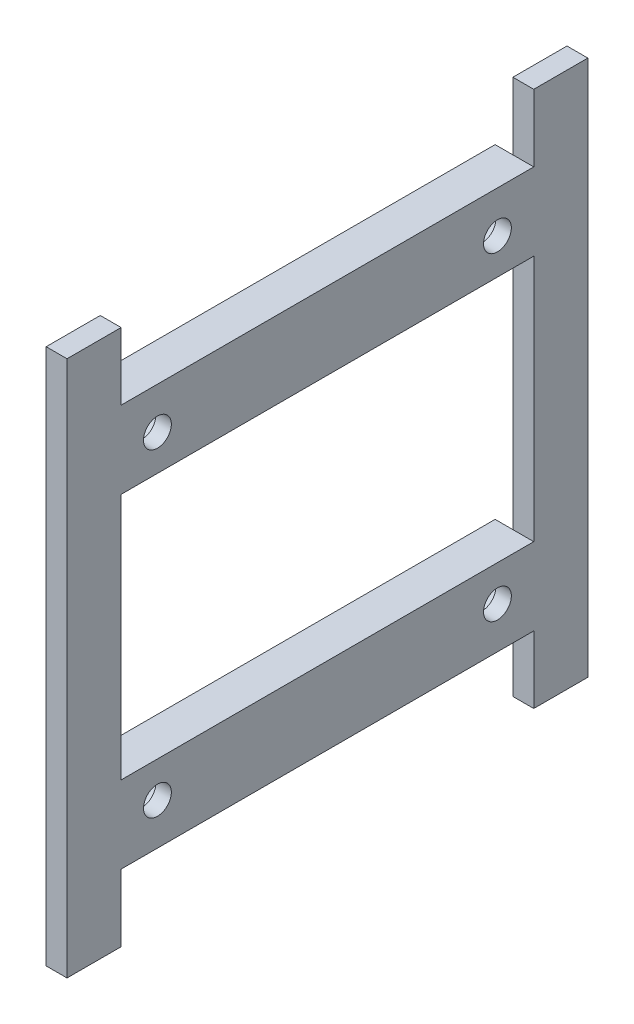
ISO-10303-21;
HEADER;
FILE_DESCRIPTION(('STEP AP214'),'2;1');
FILE_NAME('part.step','',(''),(''),'','','');
FILE_SCHEMA(('AUTOMOTIVE_DESIGN { 1 0 10303 214 1 1 1 1 }'));
ENDSEC;
DATA;
#1=APPLICATION_CONTEXT('core data for automotive mechanical design processes');
#2=APPLICATION_PROTOCOL_DEFINITION('international standard','automotive_design',2000,#1);
#3=PRODUCT_CONTEXT('',#1,'mechanical');
#4=PRODUCT('Part','Part','',(#3));
#5=PRODUCT_RELATED_PRODUCT_CATEGORY('part','',(#4));
#6=PRODUCT_DEFINITION_FORMATION('','',#4);
#7=PRODUCT_DEFINITION_CONTEXT('part definition',#1,'design');
#8=PRODUCT_DEFINITION('design','',#6,#7);
#9=PRODUCT_DEFINITION_SHAPE('','',#8);
#10=(LENGTH_UNIT() NAMED_UNIT(*) SI_UNIT(.MILLI.,.METRE.));
#11=(NAMED_UNIT(*) PLANE_ANGLE_UNIT() SI_UNIT($,.RADIAN.));
#12=(NAMED_UNIT(*) SI_UNIT($,.STERADIAN.) SOLID_ANGLE_UNIT());
#13=UNCERTAINTY_MEASURE_WITH_UNIT(LENGTH_MEASURE(1.E-05),#10,'distance_accuracy_value','');
#14=(GEOMETRIC_REPRESENTATION_CONTEXT(3) GLOBAL_UNCERTAINTY_ASSIGNED_CONTEXT((#13)) GLOBAL_UNIT_ASSIGNED_CONTEXT((#10,
#11,#12)) REPRESENTATION_CONTEXT('',''));
#15=CARTESIAN_POINT('',(0.,0.,0.));
#16=DIRECTION('',(0.,0.,1.));
#17=DIRECTION('',(1.,0.,0.));
#18=AXIS2_PLACEMENT_3D('',#15,#16,#17);
#19=CARTESIAN_POINT('',(-5.,20.6258765678246,22.));
#20=DIRECTION('',(1.,0.,0.));
#21=DIRECTION('',(0.,0.,-1.));
#22=AXIS2_PLACEMENT_3D('',#19,#20,#21);
#23=CYLINDRICAL_SURFACE('',#22,1.8);
#24=CARTESIAN_POINT('',(0.,20.6258765678246,22.));
#25=DIRECTION('',(1.,0.,0.));
#26=DIRECTION('',(0.,0.,-1.));
#27=AXIS2_PLACEMENT_3D('',#24,#25,#26);
#28=CIRCLE('',#27,1.8);
#29=CARTESIAN_POINT('',(0.,20.6258765678246,20.2));
#30=VERTEX_POINT('',#29);
#31=EDGE_CURVE('E316',#30,#30,#28,.T.);
#32=ORIENTED_EDGE('',*,*,#31,.T.);
#33=EDGE_LOOP('',(#32));
#34=FACE_BOUND('',#33,.T.);
#35=CARTESIAN_POINT('',(-2.,20.6258765678246,22.));
#36=DIRECTION('',(-1.,0.,0.));
#37=DIRECTION('',(0.,0.,1.));
#38=AXIS2_PLACEMENT_3D('',#35,#36,#37);
#39=CIRCLE('',#38,1.8);
#40=CARTESIAN_POINT('',(-2.,20.6258765678246,23.8));
#41=VERTEX_POINT('',#40);
#42=EDGE_CURVE('E103',#41,#41,#39,.F.);
#43=ORIENTED_EDGE('',*,*,#42,.F.);
#44=EDGE_LOOP('',(#43));
#45=FACE_BOUND('',#44,.T.);
#46=ADVANCED_FACE('F99',(#34,#45),#23,.F.);
#47=CARTESIAN_POINT('',(-5.,20.6258765678246,-22.));
#48=DIRECTION('',(1.,0.,0.));
#49=DIRECTION('',(0.,0.,-1.));
#50=AXIS2_PLACEMENT_3D('',#47,#48,#49);
#51=CYLINDRICAL_SURFACE('',#50,1.8);
#52=CARTESIAN_POINT('',(0.,20.6258765678246,-22.));
#53=DIRECTION('',(-1.,0.,0.));
#54=DIRECTION('',(0.,0.,1.));
#55=AXIS2_PLACEMENT_3D('',#52,#53,#54);
#56=CIRCLE('',#55,1.8);
#57=CARTESIAN_POINT('',(0.,20.6258765678246,-20.2));
#58=VERTEX_POINT('',#57);
#59=EDGE_CURVE('E327',#58,#58,#56,.T.);
#60=ORIENTED_EDGE('',*,*,#59,.F.);
#61=EDGE_LOOP('',(#60));
#62=FACE_BOUND('',#61,.T.);
#63=CARTESIAN_POINT('',(-2.,20.6258765678246,-22.));
#64=DIRECTION('',(-1.,0.,0.));
#65=DIRECTION('',(0.,0.,1.));
#66=AXIS2_PLACEMENT_3D('',#63,#64,#65);
#67=CIRCLE('',#66,1.8);
#68=CARTESIAN_POINT('',(-2.,20.6258765678246,-20.2));
#69=VERTEX_POINT('',#68);
#70=EDGE_CURVE('E466',#69,#69,#67,.T.);
#71=ORIENTED_EDGE('',*,*,#70,.T.);
#72=EDGE_LOOP('',(#71));
#73=FACE_BOUND('',#72,.T.);
#74=ADVANCED_FACE('F476',(#62,#73),#51,.F.);
#75=CARTESIAN_POINT('',(-5.,-20.6258765678246,22.));
#76=DIRECTION('',(1.,0.,0.));
#77=DIRECTION('',(0.,0.,-1.));
#78=AXIS2_PLACEMENT_3D('',#75,#76,#77);
#79=CYLINDRICAL_SURFACE('',#78,1.8);
#80=CARTESIAN_POINT('',(0.,-20.6258765678246,22.));
#81=DIRECTION('',(-1.,0.,0.));
#82=DIRECTION('',(0.,0.,1.));
#83=AXIS2_PLACEMENT_3D('',#80,#81,#82);
#84=CIRCLE('',#83,1.8);
#85=CARTESIAN_POINT('',(0.,-20.6258765678246,23.8));
#86=VERTEX_POINT('',#85);
#87=EDGE_CURVE('E370',#86,#86,#84,.T.);
#88=ORIENTED_EDGE('',*,*,#87,.F.);
#89=EDGE_LOOP('',(#88));
#90=FACE_BOUND('',#89,.T.);
#91=CARTESIAN_POINT('',(-2.,-20.6258765678246,22.));
#92=DIRECTION('',(-1.,0.,0.));
#93=DIRECTION('',(0.,0.,1.));
#94=AXIS2_PLACEMENT_3D('',#91,#92,#93);
#95=CIRCLE('',#94,1.8);
#96=CARTESIAN_POINT('',(-2.,-20.6258765678246,23.8));
#97=VERTEX_POINT('',#96);
#98=EDGE_CURVE('E464',#97,#97,#95,.T.);
#99=ORIENTED_EDGE('',*,*,#98,.T.);
#100=EDGE_LOOP('',(#99));
#101=FACE_BOUND('',#100,.T.);
#102=ADVANCED_FACE('F483',(#90,#101),#79,.F.);
#103=CARTESIAN_POINT('',(-5.,-20.6258765678246,-22.));
#104=DIRECTION('',(1.,0.,0.));
#105=DIRECTION('',(0.,0.,-1.));
#106=AXIS2_PLACEMENT_3D('',#103,#104,#105);
#107=CYLINDRICAL_SURFACE('',#106,1.8);
#108=CARTESIAN_POINT('',(0.,-20.6258765678246,-22.));
#109=DIRECTION('',(1.,0.,0.));
#110=DIRECTION('',(0.,0.,-1.));
#111=AXIS2_PLACEMENT_3D('',#108,#109,#110);
#112=CIRCLE('',#111,1.8);
#113=CARTESIAN_POINT('',(0.,-20.6258765678246,-23.8));
#114=VERTEX_POINT('',#113);
#115=EDGE_CURVE('E367',#114,#114,#112,.T.);
#116=ORIENTED_EDGE('',*,*,#115,.T.);
#117=EDGE_LOOP('',(#116));
#118=FACE_BOUND('',#117,.T.);
#119=CARTESIAN_POINT('',(-2.,-20.6258765678246,-22.));
#120=DIRECTION('',(-1.,0.,0.));
#121=DIRECTION('',(0.,0.,1.));
#122=AXIS2_PLACEMENT_3D('',#119,#120,#121);
#123=CIRCLE('',#122,1.8);
#124=CARTESIAN_POINT('',(-2.,-20.6258765678246,-20.2));
#125=VERTEX_POINT('',#124);
#126=EDGE_CURVE('E397',#125,#125,#123,.F.);
#127=ORIENTED_EDGE('',*,*,#126,.F.);
#128=EDGE_LOOP('',(#127));
#129=FACE_BOUND('',#128,.T.);
#130=ADVANCED_FACE('F524',(#118,#129),#107,.F.);
#131=CARTESIAN_POINT('',(-2.7,-34.7,26.7));
#132=DIRECTION('',(0.,0.,-1.));
#133=DIRECTION('',(0.,1.,0.));
#134=AXIS2_PLACEMENT_3D('',#131,#132,#133);
#135=PLANE('',#134);
#136=DIRECTION('',(0.,1.,0.));
#137=VECTOR('',#136,1.);
#138=CARTESIAN_POINT('',(0.,-34.7,26.7));
#139=LINE('',#138,#137);
#140=CARTESIAN_POINT('',(0.,-16.,26.7));
#141=VERTEX_POINT('',#140);
#142=CARTESIAN_POINT('',(0.,16.,26.7));
#143=VERTEX_POINT('',#142);
#144=EDGE_CURVE('E270',#141,#143,#139,.T.);
#145=ORIENTED_EDGE('',*,*,#144,.F.);
#146=DIRECTION('',(1.,0.,0.));
#147=VECTOR('',#146,1.);
#148=CARTESIAN_POINT('',(-5.,-16.,26.7));
#149=LINE('',#148,#147);
#150=CARTESIAN_POINT('',(-2.7,-16.,26.7));
#151=VERTEX_POINT('',#150);
#152=EDGE_CURVE('E389',#151,#141,#149,.T.);
#153=ORIENTED_EDGE('',*,*,#152,.F.);
#154=DIRECTION('',(0.,1.,0.));
#155=VECTOR('',#154,1.);
#156=CARTESIAN_POINT('',(-2.7,-34.7,26.7));
#157=LINE('',#156,#155);
#158=CARTESIAN_POINT('',(-2.7,16.,26.7));
#159=VERTEX_POINT('',#158);
#160=EDGE_CURVE('E293',#151,#159,#157,.T.);
#161=ORIENTED_EDGE('',*,*,#160,.T.);
#162=DIRECTION('',(1.,0.,0.));
#163=VECTOR('',#162,1.);
#164=CARTESIAN_POINT('',(-5.,16.,26.7));
#165=LINE('',#164,#163);
#166=EDGE_CURVE('E304',#159,#143,#165,.T.);
#167=ORIENTED_EDGE('',*,*,#166,.T.);
#168=EDGE_LOOP('',(#145,#153,#161,#167));
#169=FACE_BOUND('',#168,.T.);
#170=ADVANCED_FACE('F436',(#169),#135,.T.);
#171=CARTESIAN_POINT('',(-2.7,-34.7,-26.7));
#172=DIRECTION('',(0.,0.,-1.));
#173=DIRECTION('',(0.,1.,0.));
#174=AXIS2_PLACEMENT_3D('',#171,#172,#173);
#175=PLANE('',#174);
#176=DIRECTION('',(1.,0.,0.));
#177=VECTOR('',#176,1.);
#178=CARTESIAN_POINT('',(-5.,-16.,-26.7));
#179=LINE('',#178,#177);
#180=CARTESIAN_POINT('',(-2.7,-16.,-26.7));
#181=VERTEX_POINT('',#180);
#182=CARTESIAN_POINT('',(0.,-16.,-26.7));
#183=VERTEX_POINT('',#182);
#184=EDGE_CURVE('E385',#181,#183,#179,.T.);
#185=ORIENTED_EDGE('',*,*,#184,.T.);
#186=DIRECTION('',(0.,1.,0.));
#187=VECTOR('',#186,1.);
#188=CARTESIAN_POINT('',(0.,-34.7,-26.7));
#189=LINE('',#188,#187);
#190=CARTESIAN_POINT('',(0.,16.,-26.7));
#191=VERTEX_POINT('',#190);
#192=EDGE_CURVE('E349',#183,#191,#189,.T.);
#193=ORIENTED_EDGE('',*,*,#192,.T.);
#194=DIRECTION('',(1.,0.,0.));
#195=VECTOR('',#194,1.);
#196=CARTESIAN_POINT('',(-5.,16.,-26.7));
#197=LINE('',#196,#195);
#198=CARTESIAN_POINT('',(-2.7,16.,-26.7));
#199=VERTEX_POINT('',#198);
#200=EDGE_CURVE('E302',#199,#191,#197,.T.);
#201=ORIENTED_EDGE('',*,*,#200,.F.);
#202=DIRECTION('',(0.,1.,0.));
#203=VECTOR('',#202,1.);
#204=CARTESIAN_POINT('',(-2.7,-34.7,-26.7));
#205=LINE('',#204,#203);
#206=EDGE_CURVE('E337',#181,#199,#205,.T.);
#207=ORIENTED_EDGE('',*,*,#206,.F.);
#208=EDGE_LOOP('',(#185,#193,#201,#207));
#209=FACE_BOUND('',#208,.T.);
#210=ADVANCED_FACE('F501',(#209),#175,.F.);
#211=CARTESIAN_POINT('',(-5.,26.,-26.7));
#212=DIRECTION('',(0.,0.,1.));
#213=DIRECTION('',(1.,0.,0.));
#214=AXIS2_PLACEMENT_3D('',#211,#212,#213);
#215=PLANE('',#214);
#216=CARTESIAN_POINT('',(-2.7,26.,-26.7));
#217=VERTEX_POINT('',#216);
#218=EDGE_CURVE('E12',#199,#217,#205,.T.);
#219=ORIENTED_EDGE('',*,*,#218,.F.);
#220=CARTESIAN_POINT('',(-5.,16.,-26.7));
#221=VERTEX_POINT('',#220);
#222=EDGE_CURVE('E305',#221,#199,#197,.T.);
#223=ORIENTED_EDGE('',*,*,#222,.F.);
#224=DIRECTION('',(0.,-1.,0.));
#225=VECTOR('',#224,1.);
#226=CARTESIAN_POINT('',(-5.,26.,-26.7));
#227=LINE('',#226,#225);
#228=CARTESIAN_POINT('',(-5.,26.,-26.7));
#229=VERTEX_POINT('',#228);
#230=EDGE_CURVE('E318',#229,#221,#227,.T.);
#231=ORIENTED_EDGE('',*,*,#230,.F.);
#232=DIRECTION('',(1.,0.,0.));
#233=VECTOR('',#232,1.);
#234=CARTESIAN_POINT('',(-5.,26.,-26.7));
#235=LINE('',#234,#233);
#236=EDGE_CURVE('E283',#229,#217,#235,.T.);
#237=ORIENTED_EDGE('',*,*,#236,.T.);
#238=EDGE_LOOP('',(#219,#223,#231,#237));
#239=FACE_BOUND('',#238,.T.);
#240=ADVANCED_FACE('F498',(#239),#215,.F.);
#241=DIRECTION('',(1.,0.,0.));
#242=VECTOR('',#241,1.);
#243=CARTESIAN_POINT('',(-5.,-26.,26.7));
#244=LINE('',#243,#242);
#245=CARTESIAN_POINT('',(-2.7,-26.,26.7));
#246=VERTEX_POINT('',#245);
#247=CARTESIAN_POINT('',(0.,-26.,26.7));
#248=VERTEX_POINT('',#247);
#249=EDGE_CURVE('E243',#246,#248,#244,.T.);
#250=ORIENTED_EDGE('',*,*,#249,.T.);
#251=CARTESIAN_POINT('',(0.,-34.7,26.7));
#252=VERTEX_POINT('',#251);
#253=EDGE_CURVE('E257',#252,#248,#139,.T.);
#254=ORIENTED_EDGE('',*,*,#253,.F.);
#255=DIRECTION('',(1.,0.,0.));
#256=VECTOR('',#255,1.);
#257=CARTESIAN_POINT('',(-2.7,-34.7,26.7));
#258=LINE('',#257,#256);
#259=CARTESIAN_POINT('',(-2.7,-34.7,26.7));
#260=VERTEX_POINT('',#259);
#261=EDGE_CURVE('E288',#260,#252,#258,.T.);
#262=ORIENTED_EDGE('',*,*,#261,.F.);
#263=EDGE_CURVE('E260',#260,#246,#157,.T.);
#264=ORIENTED_EDGE('',*,*,#263,.T.);
#265=EDGE_LOOP('',(#250,#254,#262,#264));
#266=FACE_BOUND('',#265,.T.);
#267=ADVANCED_FACE('F256',(#266),#135,.T.);
#268=CARTESIAN_POINT('',(-2.7,-34.7,33.7));
#269=DIRECTION('',(0.,-1.,0.));
#270=DIRECTION('',(0.,0.,-1.));
#271=AXIS2_PLACEMENT_3D('',#268,#269,#270);
#272=PLANE('',#271);
#273=DIRECTION('',(0.,0.,-1.));
#274=VECTOR('',#273,1.);
#275=CARTESIAN_POINT('',(0.,-34.7,33.7));
#276=LINE('',#275,#274);
#277=CARTESIAN_POINT('',(0.,-34.7,33.7));
#278=VERTEX_POINT('',#277);
#279=EDGE_CURVE('E268',#278,#252,#276,.T.);
#280=ORIENTED_EDGE('',*,*,#279,.F.);
#281=DIRECTION('',(1.,0.,0.));
#282=VECTOR('',#281,1.);
#283=CARTESIAN_POINT('',(-2.7,-34.7,33.7));
#284=LINE('',#283,#282);
#285=CARTESIAN_POINT('',(-2.7,-34.7,33.7));
#286=VERTEX_POINT('',#285);
#287=EDGE_CURVE('E457',#286,#278,#284,.T.);
#288=ORIENTED_EDGE('',*,*,#287,.F.);
#289=DIRECTION('',(0.,0.,-1.));
#290=VECTOR('',#289,1.);
#291=CARTESIAN_POINT('',(-2.7,-34.7,33.7));
#292=LINE('',#291,#290);
#293=EDGE_CURVE('E295',#286,#260,#292,.T.);
#294=ORIENTED_EDGE('',*,*,#293,.T.);
#295=ORIENTED_EDGE('',*,*,#261,.T.);
#296=EDGE_LOOP('',(#280,#288,#294,#295));
#297=FACE_BOUND('',#296,.T.);
#298=ADVANCED_FACE('F101',(#297),#272,.T.);
#299=CARTESIAN_POINT('',(-2.7,-34.7,33.7));
#300=DIRECTION('',(0.,0.,-1.));
#301=DIRECTION('',(0.,1.,0.));
#302=AXIS2_PLACEMENT_3D('',#299,#300,#301);
#303=PLANE('',#302);
#304=DIRECTION('',(0.,1.,0.));
#305=VECTOR('',#304,1.);
#306=CARTESIAN_POINT('',(0.,-34.7,33.7));
#307=LINE('',#306,#305);
#308=CARTESIAN_POINT('',(0.,34.7,33.7));
#309=VERTEX_POINT('',#308);
#310=EDGE_CURVE('E274',#278,#309,#307,.T.);
#311=ORIENTED_EDGE('',*,*,#310,.T.);
#312=DIRECTION('',(1.,0.,0.));
#313=VECTOR('',#312,1.);
#314=CARTESIAN_POINT('',(-2.7,34.7,33.7));
#315=LINE('',#314,#313);
#316=CARTESIAN_POINT('',(-2.7,34.7,33.7));
#317=VERTEX_POINT('',#316);
#318=EDGE_CURVE('E455',#317,#309,#315,.T.);
#319=ORIENTED_EDGE('',*,*,#318,.F.);
#320=DIRECTION('',(0.,1.,0.));
#321=VECTOR('',#320,1.);
#322=CARTESIAN_POINT('',(-2.7,-34.7,33.7));
#323=LINE('',#322,#321);
#324=EDGE_CURVE('E286',#286,#317,#323,.T.);
#325=ORIENTED_EDGE('',*,*,#324,.F.);
#326=ORIENTED_EDGE('',*,*,#287,.T.);
#327=EDGE_LOOP('',(#311,#319,#325,#326));
#328=FACE_BOUND('',#327,.T.);
#329=ADVANCED_FACE('F514',(#328),#303,.F.);
#330=CARTESIAN_POINT('',(-2.7,34.7,33.7));
#331=DIRECTION('',(0.,-1.,0.));
#332=DIRECTION('',(0.,0.,-1.));
#333=AXIS2_PLACEMENT_3D('',#330,#331,#332);
#334=PLANE('',#333);
#335=DIRECTION('',(0.,0.,-1.));
#336=VECTOR('',#335,1.);
#337=CARTESIAN_POINT('',(0.,34.7,33.7));
#338=LINE('',#337,#336);
#339=CARTESIAN_POINT('',(0.,34.7,26.7));
#340=VERTEX_POINT('',#339);
#341=EDGE_CURVE('E269',#309,#340,#338,.T.);
#342=ORIENTED_EDGE('',*,*,#341,.T.);
#343=DIRECTION('',(1.,0.,0.));
#344=VECTOR('',#343,1.);
#345=CARTESIAN_POINT('',(-2.7,34.7,26.7));
#346=LINE('',#345,#344);
#347=CARTESIAN_POINT('',(-2.7,34.7,26.7));
#348=VERTEX_POINT('',#347);
#349=EDGE_CURVE('E448',#348,#340,#346,.T.);
#350=ORIENTED_EDGE('',*,*,#349,.F.);
#351=DIRECTION('',(0.,0.,-1.));
#352=VECTOR('',#351,1.);
#353=CARTESIAN_POINT('',(-2.7,34.7,33.7));
#354=LINE('',#353,#352);
#355=EDGE_CURVE('E289',#317,#348,#354,.T.);
#356=ORIENTED_EDGE('',*,*,#355,.F.);
#357=ORIENTED_EDGE('',*,*,#318,.T.);
#358=EDGE_LOOP('',(#342,#350,#356,#357));
#359=FACE_BOUND('',#358,.T.);
#360=ADVANCED_FACE('F454',(#359),#334,.F.);
#361=DIRECTION('',(1.,0.,0.));
#362=VECTOR('',#361,1.);
#363=CARTESIAN_POINT('',(-5.,26.,26.7));
#364=LINE('',#363,#362);
#365=CARTESIAN_POINT('',(-2.7,26.,26.7));
#366=VERTEX_POINT('',#365);
#367=CARTESIAN_POINT('',(0.,26.,26.7));
#368=VERTEX_POINT('',#367);
#369=EDGE_CURVE('E108',#366,#368,#364,.T.);
#370=ORIENTED_EDGE('',*,*,#369,.F.);
#371=EDGE_CURVE('E298',#366,#348,#157,.T.);
#372=ORIENTED_EDGE('',*,*,#371,.T.);
#373=ORIENTED_EDGE('',*,*,#349,.T.);
#374=EDGE_CURVE('E272',#368,#340,#139,.T.);
#375=ORIENTED_EDGE('',*,*,#374,.F.);
#376=EDGE_LOOP('',(#370,#372,#373,#375));
#377=FACE_BOUND('',#376,.T.);
#378=ADVANCED_FACE('F446',(#377),#135,.T.);
#379=CARTESIAN_POINT('',(-2.7,0.,0.));
#380=DIRECTION('',(1.,0.,0.));
#381=DIRECTION('',(0.,0.,-1.));
#382=AXIS2_PLACEMENT_3D('',#379,#380,#381);
#383=PLANE('',#382);
#384=ORIENTED_EDGE('',*,*,#293,.F.);
#385=ORIENTED_EDGE('',*,*,#324,.T.);
#386=ORIENTED_EDGE('',*,*,#355,.T.);
#387=ORIENTED_EDGE('',*,*,#371,.F.);
#388=EDGE_CURVE('E294',#159,#366,#157,.T.);
#389=ORIENTED_EDGE('',*,*,#388,.F.);
#390=ORIENTED_EDGE('',*,*,#160,.F.);
#391=DIRECTION('',(0.,1.,0.));
#392=VECTOR('',#391,1.);
#393=CARTESIAN_POINT('',(-2.7,0.,26.7));
#394=LINE('',#393,#392);
#395=EDGE_CURVE('E365',#246,#151,#394,.T.);
#396=ORIENTED_EDGE('',*,*,#395,.F.);
#397=ORIENTED_EDGE('',*,*,#263,.F.);
#398=EDGE_LOOP('',(#384,#385,#386,#387,#389,#390,#396,#397));
#399=FACE_BOUND('',#398,.T.);
#400=ADVANCED_FACE('F442',(#399),#383,.F.);
#401=CARTESIAN_POINT('',(0.,0.,0.));
#402=DIRECTION('',(1.,0.,0.));
#403=DIRECTION('',(0.,0.,-1.));
#404=AXIS2_PLACEMENT_3D('',#401,#402,#403);
#405=PLANE('',#404);
#406=DIRECTION('',(0.,0.,-1.));
#407=VECTOR('',#406,1.);
#408=CARTESIAN_POINT('',(0.,-16.,26.7));
#409=LINE('',#408,#407);
#410=EDGE_CURVE('E118',#141,#183,#409,.T.);
#411=ORIENTED_EDGE('',*,*,#410,.F.);
#412=ORIENTED_EDGE('',*,*,#144,.T.);
#413=DIRECTION('',(0.,0.,-1.));
#414=VECTOR('',#413,1.);
#415=CARTESIAN_POINT('',(0.,16.,26.7));
#416=LINE('',#415,#414);
#417=EDGE_CURVE('E313',#143,#191,#416,.T.);
#418=ORIENTED_EDGE('',*,*,#417,.T.);
#419=ORIENTED_EDGE('',*,*,#192,.F.);
#420=EDGE_LOOP('',(#411,#412,#418,#419));
#421=FACE_BOUND('',#420,.T.);
#422=ORIENTED_EDGE('',*,*,#279,.T.);
#423=ORIENTED_EDGE('',*,*,#253,.T.);
#424=DIRECTION('',(0.,0.,-1.));
#425=VECTOR('',#424,1.);
#426=CARTESIAN_POINT('',(0.,-26.,26.7));
#427=LINE('',#426,#425);
#428=CARTESIAN_POINT('',(0.,-26.,-26.7));
#429=VERTEX_POINT('',#428);
#430=EDGE_CURVE('E240',#248,#429,#427,.T.);
#431=ORIENTED_EDGE('',*,*,#430,.T.);
#432=CARTESIAN_POINT('',(0.,-34.7,-26.7));
#433=VERTEX_POINT('',#432);
#434=EDGE_CURVE('E347',#433,#429,#189,.T.);
#435=ORIENTED_EDGE('',*,*,#434,.F.);
#436=DIRECTION('',(0.,0.,1.));
#437=VECTOR('',#436,1.);
#438=CARTESIAN_POINT('',(0.,-34.7,-33.7));
#439=LINE('',#438,#437);
#440=CARTESIAN_POINT('',(0.,-34.7,-33.7));
#441=VERTEX_POINT('',#440);
#442=EDGE_CURVE('E330',#441,#433,#439,.T.);
#443=ORIENTED_EDGE('',*,*,#442,.F.);
#444=DIRECTION('',(0.,1.,0.));
#445=VECTOR('',#444,1.);
#446=CARTESIAN_POINT('',(0.,-34.7,-33.7));
#447=LINE('',#446,#445);
#448=CARTESIAN_POINT('',(0.,34.7,-33.7));
#449=VERTEX_POINT('',#448);
#450=EDGE_CURVE('E333',#441,#449,#447,.T.);
#451=ORIENTED_EDGE('',*,*,#450,.T.);
#452=DIRECTION('',(0.,0.,1.));
#453=VECTOR('',#452,1.);
#454=CARTESIAN_POINT('',(0.,34.7,-33.7));
#455=LINE('',#454,#453);
#456=CARTESIAN_POINT('',(0.,34.7,-26.7));
#457=VERTEX_POINT('',#456);
#458=EDGE_CURVE('E351',#449,#457,#455,.T.);
#459=ORIENTED_EDGE('',*,*,#458,.T.);
#460=CARTESIAN_POINT('',(0.,26.,-26.7));
#461=VERTEX_POINT('',#460);
#462=EDGE_CURVE('E350',#461,#457,#189,.T.);
#463=ORIENTED_EDGE('',*,*,#462,.F.);
#464=DIRECTION('',(0.,0.,-1.));
#465=VECTOR('',#464,1.);
#466=CARTESIAN_POINT('',(0.,26.,26.7));
#467=LINE('',#466,#465);
#468=EDGE_CURVE('E310',#368,#461,#467,.T.);
#469=ORIENTED_EDGE('',*,*,#468,.F.);
#470=ORIENTED_EDGE('',*,*,#374,.T.);
#471=ORIENTED_EDGE('',*,*,#341,.F.);
#472=ORIENTED_EDGE('',*,*,#310,.F.);
#473=EDGE_LOOP('',(#422,#423,#431,#435,#443,#451,#459,#463,#469,#470,#471,#472));
#474=FACE_BOUND('',#473,.T.);
#475=ORIENTED_EDGE('',*,*,#31,.F.);
#476=EDGE_LOOP('',(#475));
#477=FACE_BOUND('',#476,.T.);
#478=ORIENTED_EDGE('',*,*,#59,.T.);
#479=EDGE_LOOP('',(#478));
#480=FACE_BOUND('',#479,.T.);
#481=ORIENTED_EDGE('',*,*,#115,.F.);
#482=EDGE_LOOP('',(#481));
#483=FACE_BOUND('',#482,.T.);
#484=ORIENTED_EDGE('',*,*,#87,.T.);
#485=EDGE_LOOP('',(#484));
#486=FACE_BOUND('',#485,.T.);
#487=ADVANCED_FACE('F264',(#421,#474,#477,#480,#483,#486),#405,.T.);
#488=CARTESIAN_POINT('',(-5.,0.,0.));
#489=DIRECTION('',(1.,0.,0.));
#490=DIRECTION('',(0.,0.,-1.));
#491=AXIS2_PLACEMENT_3D('',#488,#489,#490);
#492=PLANE('',#491);
#493=CARTESIAN_POINT('',(-5.,20.6258765678246,22.));
#494=DIRECTION('',(-1.,0.,0.));
#495=DIRECTION('',(0.,0.,1.));
#496=AXIS2_PLACEMENT_3D('',#493,#494,#495);
#497=CIRCLE('',#496,3.15);
#498=CARTESIAN_POINT('',(-5.,20.6258765678246,25.15));
#499=VERTEX_POINT('',#498);
#500=EDGE_CURVE('E394',#499,#499,#497,.T.);
#501=ORIENTED_EDGE('',*,*,#500,.F.);
#502=EDGE_LOOP('',(#501));
#503=FACE_BOUND('',#502,.T.);
#504=CARTESIAN_POINT('',(-5.,20.6258765678246,-22.));
#505=DIRECTION('',(-1.,0.,0.));
#506=DIRECTION('',(0.,0.,1.));
#507=AXIS2_PLACEMENT_3D('',#504,#505,#506);
#508=CIRCLE('',#507,3.15);
#509=CARTESIAN_POINT('',(-5.,20.6258765678246,-18.85));
#510=VERTEX_POINT('',#509);
#511=EDGE_CURVE('E390',#510,#510,#508,.T.);
#512=ORIENTED_EDGE('',*,*,#511,.F.);
#513=EDGE_LOOP('',(#512));
#514=FACE_BOUND('',#513,.T.);
#515=DIRECTION('',(0.,-1.,0.));
#516=VECTOR('',#515,1.);
#517=CARTESIAN_POINT('',(-5.,26.,26.7));
#518=LINE('',#517,#516);
#519=CARTESIAN_POINT('',(-5.,26.,26.7));
#520=VERTEX_POINT('',#519);
#521=CARTESIAN_POINT('',(-5.,16.,26.7));
#522=VERTEX_POINT('',#521);
#523=EDGE_CURVE('E312',#520,#522,#518,.T.);
#524=ORIENTED_EDGE('',*,*,#523,.F.);
#525=DIRECTION('',(0.,0.,-1.));
#526=VECTOR('',#525,1.);
#527=CARTESIAN_POINT('',(-5.,26.,26.7));
#528=LINE('',#527,#526);
#529=EDGE_CURVE('E303',#520,#229,#528,.T.);
#530=ORIENTED_EDGE('',*,*,#529,.T.);
#531=ORIENTED_EDGE('',*,*,#230,.T.);
#532=DIRECTION('',(0.,0.,-1.));
#533=VECTOR('',#532,1.);
#534=CARTESIAN_POINT('',(-5.,16.,26.7));
#535=LINE('',#534,#533);
#536=EDGE_CURVE('E320',#522,#221,#535,.T.);
#537=ORIENTED_EDGE('',*,*,#536,.F.);
#538=EDGE_LOOP('',(#524,#530,#531,#537));
#539=FACE_BOUND('',#538,.T.);
#540=ADVANCED_FACE('F488',(#503,#514,#539),#492,.F.);
#541=CARTESIAN_POINT('',(-5.,26.,26.7));
#542=DIRECTION('',(0.,0.,1.));
#543=DIRECTION('',(1.,0.,0.));
#544=AXIS2_PLACEMENT_3D('',#541,#542,#543);
#545=PLANE('',#544);
#546=EDGE_CURVE('E299',#522,#159,#165,.T.);
#547=ORIENTED_EDGE('',*,*,#546,.T.);
#548=ORIENTED_EDGE('',*,*,#388,.T.);
#549=EDGE_CURVE('E281',#520,#366,#364,.T.);
#550=ORIENTED_EDGE('',*,*,#549,.F.);
#551=ORIENTED_EDGE('',*,*,#523,.T.);
#552=EDGE_LOOP('',(#547,#548,#550,#551));
#553=FACE_BOUND('',#552,.T.);
#554=ADVANCED_FACE('F491',(#553),#545,.T.);
#555=CARTESIAN_POINT('',(-5.,26.,26.7));
#556=DIRECTION('',(0.,-1.,0.));
#557=DIRECTION('',(0.,0.,-1.));
#558=AXIS2_PLACEMENT_3D('',#555,#556,#557);
#559=PLANE('',#558);
#560=ORIENTED_EDGE('',*,*,#468,.T.);
#561=EDGE_CURVE('E308',#217,#461,#235,.T.);
#562=ORIENTED_EDGE('',*,*,#561,.F.);
#563=ORIENTED_EDGE('',*,*,#236,.F.);
#564=ORIENTED_EDGE('',*,*,#529,.F.);
#565=ORIENTED_EDGE('',*,*,#549,.T.);
#566=ORIENTED_EDGE('',*,*,#369,.T.);
#567=EDGE_LOOP('',(#560,#562,#563,#564,#565,#566));
#568=FACE_BOUND('',#567,.T.);
#569=ADVANCED_FACE('F493',(#568),#559,.F.);
#570=CARTESIAN_POINT('',(-5.,16.,26.7));
#571=DIRECTION('',(0.,-1.,0.));
#572=DIRECTION('',(0.,0.,-1.));
#573=AXIS2_PLACEMENT_3D('',#570,#571,#572);
#574=PLANE('',#573);
#575=ORIENTED_EDGE('',*,*,#417,.F.);
#576=ORIENTED_EDGE('',*,*,#166,.F.);
#577=ORIENTED_EDGE('',*,*,#546,.F.);
#578=ORIENTED_EDGE('',*,*,#536,.T.);
#579=ORIENTED_EDGE('',*,*,#222,.T.);
#580=ORIENTED_EDGE('',*,*,#200,.T.);
#581=EDGE_LOOP('',(#575,#576,#577,#578,#579,#580));
#582=FACE_BOUND('',#581,.T.);
#583=ADVANCED_FACE('F496',(#582),#574,.T.);
#584=CARTESIAN_POINT('',(-2.7,34.7,-26.7));
#585=VERTEX_POINT('',#584);
#586=EDGE_CURVE('E111',#217,#585,#205,.T.);
#587=ORIENTED_EDGE('',*,*,#586,.F.);
#588=ORIENTED_EDGE('',*,*,#561,.T.);
#589=ORIENTED_EDGE('',*,*,#462,.T.);
#590=DIRECTION('',(1.,0.,0.));
#591=VECTOR('',#590,1.);
#592=CARTESIAN_POINT('',(-2.7,34.7,-26.7));
#593=LINE('',#592,#591);
#594=EDGE_CURVE('E359',#585,#457,#593,.T.);
#595=ORIENTED_EDGE('',*,*,#594,.F.);
#596=EDGE_LOOP('',(#587,#588,#589,#595));
#597=FACE_BOUND('',#596,.T.);
#598=ADVANCED_FACE('F505',(#597),#175,.F.);
#599=CARTESIAN_POINT('',(-2.7,-34.7,-33.7));
#600=DIRECTION('',(0.,1.,0.));
#601=DIRECTION('',(0.,0.,1.));
#602=AXIS2_PLACEMENT_3D('',#599,#600,#601);
#603=PLANE('',#602);
#604=ORIENTED_EDGE('',*,*,#442,.T.);
#605=DIRECTION('',(1.,0.,0.));
#606=VECTOR('',#605,1.);
#607=CARTESIAN_POINT('',(-2.7,-34.7,-26.7));
#608=LINE('',#607,#606);
#609=CARTESIAN_POINT('',(-2.7,-34.7,-26.7));
#610=VERTEX_POINT('',#609);
#611=EDGE_CURVE('E362',#610,#433,#608,.T.);
#612=ORIENTED_EDGE('',*,*,#611,.F.);
#613=DIRECTION('',(0.,0.,1.));
#614=VECTOR('',#613,1.);
#615=CARTESIAN_POINT('',(-2.7,-34.7,-33.7));
#616=LINE('',#615,#614);
#617=CARTESIAN_POINT('',(-2.7,-34.7,-33.7));
#618=VERTEX_POINT('',#617);
#619=EDGE_CURVE('E331',#618,#610,#616,.T.);
#620=ORIENTED_EDGE('',*,*,#619,.F.);
#621=DIRECTION('',(1.,0.,0.));
#622=VECTOR('',#621,1.);
#623=CARTESIAN_POINT('',(-2.7,-34.7,-33.7));
#624=LINE('',#623,#622);
#625=EDGE_CURVE('E344',#618,#441,#624,.T.);
#626=ORIENTED_EDGE('',*,*,#625,.T.);
#627=EDGE_LOOP('',(#604,#612,#620,#626));
#628=FACE_BOUND('',#627,.T.);
#629=ADVANCED_FACE('F571',(#628),#603,.F.);
#630=ORIENTED_EDGE('',*,*,#434,.T.);
#631=DIRECTION('',(1.,0.,0.));
#632=VECTOR('',#631,1.);
#633=CARTESIAN_POINT('',(-5.,-26.,-26.7));
#634=LINE('',#633,#632);
#635=CARTESIAN_POINT('',(-2.7,-26.,-26.7));
#636=VERTEX_POINT('',#635);
#637=EDGE_CURVE('E247',#636,#429,#634,.T.);
#638=ORIENTED_EDGE('',*,*,#637,.F.);
#639=EDGE_CURVE('E110',#610,#636,#205,.T.);
#640=ORIENTED_EDGE('',*,*,#639,.F.);
#641=ORIENTED_EDGE('',*,*,#611,.T.);
#642=EDGE_LOOP('',(#630,#638,#640,#641));
#643=FACE_BOUND('',#642,.T.);
#644=ADVANCED_FACE('F557',(#643),#175,.F.);
#645=CARTESIAN_POINT('',(-2.7,34.7,-33.7));
#646=DIRECTION('',(0.,1.,0.));
#647=DIRECTION('',(0.,0.,1.));
#648=AXIS2_PLACEMENT_3D('',#645,#646,#647);
#649=PLANE('',#648);
#650=ORIENTED_EDGE('',*,*,#458,.F.);
#651=DIRECTION('',(1.,0.,0.));
#652=VECTOR('',#651,1.);
#653=CARTESIAN_POINT('',(-2.7,34.7,-33.7));
#654=LINE('',#653,#652);
#655=CARTESIAN_POINT('',(-2.7,34.7,-33.7));
#656=VERTEX_POINT('',#655);
#657=EDGE_CURVE('E357',#656,#449,#654,.T.);
#658=ORIENTED_EDGE('',*,*,#657,.F.);
#659=DIRECTION('',(0.,0.,1.));
#660=VECTOR('',#659,1.);
#661=CARTESIAN_POINT('',(-2.7,34.7,-33.7));
#662=LINE('',#661,#660);
#663=EDGE_CURVE('E338',#656,#585,#662,.T.);
#664=ORIENTED_EDGE('',*,*,#663,.T.);
#665=ORIENTED_EDGE('',*,*,#594,.T.);
#666=EDGE_LOOP('',(#650,#658,#664,#665));
#667=FACE_BOUND('',#666,.T.);
#668=ADVANCED_FACE('F567',(#667),#649,.T.);
#669=CARTESIAN_POINT('',(-2.7,-34.7,-33.7));
#670=DIRECTION('',(0.,0.,-1.));
#671=DIRECTION('',(0.,1.,0.));
#672=AXIS2_PLACEMENT_3D('',#669,#670,#671);
#673=PLANE('',#672);
#674=ORIENTED_EDGE('',*,*,#450,.F.);
#675=ORIENTED_EDGE('',*,*,#625,.F.);
#676=DIRECTION('',(0.,1.,0.));
#677=VECTOR('',#676,1.);
#678=CARTESIAN_POINT('',(-2.7,-34.7,-33.7));
#679=LINE('',#678,#677);
#680=EDGE_CURVE('E341',#618,#656,#679,.T.);
#681=ORIENTED_EDGE('',*,*,#680,.T.);
#682=ORIENTED_EDGE('',*,*,#657,.T.);
#683=EDGE_LOOP('',(#674,#675,#681,#682));
#684=FACE_BOUND('',#683,.T.);
#685=ADVANCED_FACE('F563',(#684),#673,.T.);
#686=CARTESIAN_POINT('',(-2.7,0.,0.));
#687=DIRECTION('',(-1.,0.,0.));
#688=DIRECTION('',(0.,0.,1.));
#689=AXIS2_PLACEMENT_3D('',#686,#687,#688);
#690=PLANE('',#689);
#691=ORIENTED_EDGE('',*,*,#619,.T.);
#692=ORIENTED_EDGE('',*,*,#639,.T.);
#693=EDGE_CURVE('E336',#636,#181,#205,.T.);
#694=ORIENTED_EDGE('',*,*,#693,.T.);
#695=ORIENTED_EDGE('',*,*,#206,.T.);
#696=ORIENTED_EDGE('',*,*,#218,.T.);
#697=ORIENTED_EDGE('',*,*,#586,.T.);
#698=ORIENTED_EDGE('',*,*,#663,.F.);
#699=ORIENTED_EDGE('',*,*,#680,.F.);
#700=EDGE_LOOP('',(#691,#692,#694,#695,#696,#697,#698,#699));
#701=FACE_BOUND('',#700,.T.);
#702=ADVANCED_FACE('F551',(#701),#690,.T.);
#703=CARTESIAN_POINT('',(-5.,-26.,26.7));
#704=DIRECTION('',(0.,0.,-1.));
#705=DIRECTION('',(0.,1.,0.));
#706=AXIS2_PLACEMENT_3D('',#703,#704,#705);
#707=PLANE('',#706);
#708=CARTESIAN_POINT('',(-5.,-26.,26.7));
#709=VERTEX_POINT('',#708);
#710=EDGE_CURVE('E261',#709,#246,#244,.T.);
#711=ORIENTED_EDGE('',*,*,#710,.T.);
#712=ORIENTED_EDGE('',*,*,#395,.T.);
#713=CARTESIAN_POINT('',(-5.,-16.,26.7));
#714=VERTEX_POINT('',#713);
#715=EDGE_CURVE('E386',#714,#151,#149,.T.);
#716=ORIENTED_EDGE('',*,*,#715,.F.);
#717=DIRECTION('',(0.,1.,0.));
#718=VECTOR('',#717,1.);
#719=CARTESIAN_POINT('',(-5.,-26.,26.7));
#720=LINE('',#719,#718);
#721=EDGE_CURVE('E251',#709,#714,#720,.T.);
#722=ORIENTED_EDGE('',*,*,#721,.F.);
#723=EDGE_LOOP('',(#711,#712,#716,#722));
#724=FACE_BOUND('',#723,.T.);
#725=ADVANCED_FACE('F422',(#724),#707,.F.);
#726=CARTESIAN_POINT('',(-5.,0.,0.));
#727=DIRECTION('',(-1.,0.,0.));
#728=DIRECTION('',(0.,0.,1.));
#729=AXIS2_PLACEMENT_3D('',#726,#727,#728);
#730=PLANE('',#729);
#731=CARTESIAN_POINT('',(-5.,-20.6258765678246,-22.));
#732=DIRECTION('',(-1.,0.,0.));
#733=DIRECTION('',(0.,0.,1.));
#734=AXIS2_PLACEMENT_3D('',#731,#732,#733);
#735=CIRCLE('',#734,3.15);
#736=CARTESIAN_POINT('',(-5.,-20.6258765678246,-18.85));
#737=VERTEX_POINT('',#736);
#738=EDGE_CURVE('E401',#737,#737,#735,.T.);
#739=ORIENTED_EDGE('',*,*,#738,.F.);
#740=EDGE_LOOP('',(#739));
#741=FACE_BOUND('',#740,.T.);
#742=CARTESIAN_POINT('',(-5.,-20.6258765678246,22.));
#743=DIRECTION('',(-1.,0.,0.));
#744=DIRECTION('',(0.,0.,1.));
#745=AXIS2_PLACEMENT_3D('',#742,#743,#744);
#746=CIRCLE('',#745,3.15);
#747=CARTESIAN_POINT('',(-5.,-20.6258765678246,25.15));
#748=VERTEX_POINT('',#747);
#749=EDGE_CURVE('E402',#748,#748,#746,.T.);
#750=ORIENTED_EDGE('',*,*,#749,.F.);
#751=EDGE_LOOP('',(#750));
#752=FACE_BOUND('',#751,.T.);
#753=ORIENTED_EDGE('',*,*,#721,.T.);
#754=DIRECTION('',(0.,0.,-1.));
#755=VECTOR('',#754,1.);
#756=CARTESIAN_POINT('',(-5.,-16.,26.7));
#757=LINE('',#756,#755);
#758=CARTESIAN_POINT('',(-5.,-16.,-26.7));
#759=VERTEX_POINT('',#758);
#760=EDGE_CURVE('E375',#714,#759,#757,.T.);
#761=ORIENTED_EDGE('',*,*,#760,.T.);
#762=DIRECTION('',(0.,1.,0.));
#763=VECTOR('',#762,1.);
#764=CARTESIAN_POINT('',(-5.,-26.,-26.7));
#765=LINE('',#764,#763);
#766=CARTESIAN_POINT('',(-5.,-26.,-26.7));
#767=VERTEX_POINT('',#766);
#768=EDGE_CURVE('E377',#767,#759,#765,.T.);
#769=ORIENTED_EDGE('',*,*,#768,.F.);
#770=DIRECTION('',(0.,0.,-1.));
#771=VECTOR('',#770,1.);
#772=CARTESIAN_POINT('',(-5.,-26.,26.7));
#773=LINE('',#772,#771);
#774=EDGE_CURVE('E379',#709,#767,#773,.T.);
#775=ORIENTED_EDGE('',*,*,#774,.F.);
#776=EDGE_LOOP('',(#753,#761,#769,#775));
#777=FACE_BOUND('',#776,.T.);
#778=ADVANCED_FACE('F418',(#741,#752,#777),#730,.T.);
#779=CARTESIAN_POINT('',(-5.,-16.,26.7));
#780=DIRECTION('',(0.,-1.,0.));
#781=DIRECTION('',(0.,0.,-1.));
#782=AXIS2_PLACEMENT_3D('',#779,#780,#781);
#783=PLANE('',#782);
#784=ORIENTED_EDGE('',*,*,#410,.T.);
#785=ORIENTED_EDGE('',*,*,#184,.F.);
#786=EDGE_CURVE('E126',#759,#181,#179,.T.);
#787=ORIENTED_EDGE('',*,*,#786,.F.);
#788=ORIENTED_EDGE('',*,*,#760,.F.);
#789=ORIENTED_EDGE('',*,*,#715,.T.);
#790=ORIENTED_EDGE('',*,*,#152,.T.);
#791=EDGE_LOOP('',(#784,#785,#787,#788,#789,#790));
#792=FACE_BOUND('',#791,.T.);
#793=ADVANCED_FACE('F421',(#792),#783,.F.);
#794=CARTESIAN_POINT('',(-5.,-26.,-26.7));
#795=DIRECTION('',(0.,0.,-1.));
#796=DIRECTION('',(0.,1.,0.));
#797=AXIS2_PLACEMENT_3D('',#794,#795,#796);
#798=PLANE('',#797);
#799=ORIENTED_EDGE('',*,*,#786,.T.);
#800=ORIENTED_EDGE('',*,*,#693,.F.);
#801=EDGE_CURVE('E262',#767,#636,#634,.T.);
#802=ORIENTED_EDGE('',*,*,#801,.F.);
#803=ORIENTED_EDGE('',*,*,#768,.T.);
#804=EDGE_LOOP('',(#799,#800,#802,#803));
#805=FACE_BOUND('',#804,.T.);
#806=ADVANCED_FACE('F555',(#805),#798,.T.);
#807=CARTESIAN_POINT('',(-5.,-26.,26.7));
#808=DIRECTION('',(0.,-1.,0.));
#809=DIRECTION('',(0.,0.,-1.));
#810=AXIS2_PLACEMENT_3D('',#807,#808,#809);
#811=PLANE('',#810);
#812=ORIENTED_EDGE('',*,*,#430,.F.);
#813=ORIENTED_EDGE('',*,*,#249,.F.);
#814=ORIENTED_EDGE('',*,*,#710,.F.);
#815=ORIENTED_EDGE('',*,*,#774,.T.);
#816=ORIENTED_EDGE('',*,*,#801,.T.);
#817=ORIENTED_EDGE('',*,*,#637,.T.);
#818=EDGE_LOOP('',(#812,#813,#814,#815,#816,#817));
#819=FACE_BOUND('',#818,.T.);
#820=ADVANCED_FACE('F242',(#819),#811,.T.);
#821=CARTESIAN_POINT('',(-2.,-20.6258765678246,-22.));
#822=DIRECTION('',(-1.,0.,0.));
#823=DIRECTION('',(0.,0.,1.));
#824=AXIS2_PLACEMENT_3D('',#821,#822,#823);
#825=PLANE('',#824);
#826=CARTESIAN_POINT('',(-2.,-20.6258765678246,-22.));
#827=DIRECTION('',(-1.,0.,0.));
#828=DIRECTION('',(0.,0.,1.));
#829=AXIS2_PLACEMENT_3D('',#826,#827,#828);
#830=CIRCLE('',#829,3.15);
#831=CARTESIAN_POINT('',(-2.,-20.6258765678246,-18.85));
#832=VERTEX_POINT('',#831);
#833=EDGE_CURVE('E398',#832,#832,#830,.T.);
#834=ORIENTED_EDGE('',*,*,#833,.T.);
#835=EDGE_LOOP('',(#834));
#836=FACE_BOUND('',#835,.T.);
#837=ORIENTED_EDGE('',*,*,#126,.T.);
#838=EDGE_LOOP('',(#837));
#839=FACE_BOUND('',#838,.T.);
#840=ADVANCED_FACE('F670',(#836,#839),#825,.T.);
#841=CARTESIAN_POINT('',(-2.,-20.6258765678246,-22.));
#842=DIRECTION('',(-1.,0.,0.));
#843=DIRECTION('',(0.,0.,1.));
#844=AXIS2_PLACEMENT_3D('',#841,#842,#843);
#845=CYLINDRICAL_SURFACE('',#844,3.15);
#846=ORIENTED_EDGE('',*,*,#833,.F.);
#847=EDGE_LOOP('',(#846));
#848=FACE_BOUND('',#847,.T.);
#849=ORIENTED_EDGE('',*,*,#738,.T.);
#850=EDGE_LOOP('',(#849));
#851=FACE_BOUND('',#850,.T.);
#852=ADVANCED_FACE('F702',(#848,#851),#845,.F.);
#853=CARTESIAN_POINT('',(-2.,-20.6258765678246,22.));
#854=DIRECTION('',(-1.,0.,0.));
#855=DIRECTION('',(0.,0.,1.));
#856=AXIS2_PLACEMENT_3D('',#853,#854,#855);
#857=CYLINDRICAL_SURFACE('',#856,3.15);
#858=CARTESIAN_POINT('',(-2.,-20.6258765678246,22.));
#859=DIRECTION('',(-1.,0.,0.));
#860=DIRECTION('',(0.,0.,1.));
#861=AXIS2_PLACEMENT_3D('',#858,#859,#860);
#862=CIRCLE('',#861,3.15);
#863=CARTESIAN_POINT('',(-2.,-20.6258765678246,25.15));
#864=VERTEX_POINT('',#863);
#865=EDGE_CURVE('E410',#864,#864,#862,.T.);
#866=ORIENTED_EDGE('',*,*,#865,.F.);
#867=EDGE_LOOP('',(#866));
#868=FACE_BOUND('',#867,.T.);
#869=ORIENTED_EDGE('',*,*,#749,.T.);
#870=EDGE_LOOP('',(#869));
#871=FACE_BOUND('',#870,.T.);
#872=ADVANCED_FACE('F416',(#868,#871),#857,.F.);
#873=CARTESIAN_POINT('',(-2.,-20.6258765678246,22.));
#874=DIRECTION('',(-1.,0.,0.));
#875=DIRECTION('',(0.,0.,1.));
#876=AXIS2_PLACEMENT_3D('',#873,#874,#875);
#877=PLANE('',#876);
#878=ORIENTED_EDGE('',*,*,#98,.F.);
#879=EDGE_LOOP('',(#878));
#880=FACE_BOUND('',#879,.T.);
#881=ORIENTED_EDGE('',*,*,#865,.T.);
#882=EDGE_LOOP('',(#881));
#883=FACE_BOUND('',#882,.T.);
#884=ADVANCED_FACE('F721',(#880,#883),#877,.T.);
#885=CARTESIAN_POINT('',(-2.,20.6258765678246,-22.));
#886=DIRECTION('',(-1.,0.,0.));
#887=DIRECTION('',(0.,0.,1.));
#888=AXIS2_PLACEMENT_3D('',#885,#886,#887);
#889=CYLINDRICAL_SURFACE('',#888,3.15);
#890=CARTESIAN_POINT('',(-2.,20.6258765678246,-22.));
#891=DIRECTION('',(-1.,0.,0.));
#892=DIRECTION('',(0.,0.,1.));
#893=AXIS2_PLACEMENT_3D('',#890,#891,#892);
#894=CIRCLE('',#893,3.15);
#895=CARTESIAN_POINT('',(-2.,20.6258765678246,-18.85));
#896=VERTEX_POINT('',#895);
#897=EDGE_CURVE('E393',#896,#896,#894,.T.);
#898=ORIENTED_EDGE('',*,*,#897,.F.);
#899=EDGE_LOOP('',(#898));
#900=FACE_BOUND('',#899,.T.);
#901=ORIENTED_EDGE('',*,*,#511,.T.);
#902=EDGE_LOOP('',(#901));
#903=FACE_BOUND('',#902,.T.);
#904=ADVANCED_FACE('F731',(#900,#903),#889,.F.);
#905=CARTESIAN_POINT('',(-2.,20.6258765678246,-22.));
#906=DIRECTION('',(-1.,0.,0.));
#907=DIRECTION('',(0.,0.,1.));
#908=AXIS2_PLACEMENT_3D('',#905,#906,#907);
#909=PLANE('',#908);
#910=ORIENTED_EDGE('',*,*,#70,.F.);
#911=EDGE_LOOP('',(#910));
#912=FACE_BOUND('',#911,.T.);
#913=ORIENTED_EDGE('',*,*,#897,.T.);
#914=EDGE_LOOP('',(#913));
#915=FACE_BOUND('',#914,.T.);
#916=ADVANCED_FACE('F741',(#912,#915),#909,.T.);
#917=CARTESIAN_POINT('',(-2.,20.6258765678246,22.));
#918=DIRECTION('',(-1.,0.,0.));
#919=DIRECTION('',(0.,0.,1.));
#920=AXIS2_PLACEMENT_3D('',#917,#918,#919);
#921=PLANE('',#920);
#922=CARTESIAN_POINT('',(-2.,20.6258765678246,22.));
#923=DIRECTION('',(-1.,0.,0.));
#924=DIRECTION('',(0.,0.,1.));
#925=AXIS2_PLACEMENT_3D('',#922,#923,#924);
#926=CIRCLE('',#925,3.15);
#927=CARTESIAN_POINT('',(-2.,20.6258765678246,25.15));
#928=VERTEX_POINT('',#927);
#929=EDGE_CURVE('E405',#928,#928,#926,.T.);
#930=ORIENTED_EDGE('',*,*,#929,.T.);
#931=EDGE_LOOP('',(#930));
#932=FACE_BOUND('',#931,.T.);
#933=ORIENTED_EDGE('',*,*,#42,.T.);
#934=EDGE_LOOP('',(#933));
#935=FACE_BOUND('',#934,.T.);
#936=ADVANCED_FACE('F473',(#932,#935),#921,.T.);
#937=CARTESIAN_POINT('',(-2.,20.6258765678246,22.));
#938=DIRECTION('',(-1.,0.,0.));
#939=DIRECTION('',(0.,0.,1.));
#940=AXIS2_PLACEMENT_3D('',#937,#938,#939);
#941=CYLINDRICAL_SURFACE('',#940,3.15);
#942=ORIENTED_EDGE('',*,*,#929,.F.);
#943=EDGE_LOOP('',(#942));
#944=FACE_BOUND('',#943,.T.);
#945=ORIENTED_EDGE('',*,*,#500,.T.);
#946=EDGE_LOOP('',(#945));
#947=FACE_BOUND('',#946,.T.);
#948=ADVANCED_FACE('F760',(#944,#947),#941,.F.);
#949=CLOSED_SHELL('',(#46,#74,#102,#130,#170,#210,#240,#267,#298,#329,#360,#378,#400,#487,#540,
#554,#569,#583,#598,#629,#644,#668,#685,#702,#725,#778,#793,#806,#820,#840,#852,#872,#884,#904,
#916,#936,#948));
#950=MANIFOLD_SOLID_BREP('B2',#949);
#951=ADVANCED_BREP_SHAPE_REPRESENTATION('',(#18,#950),#14);
#952=SHAPE_DEFINITION_REPRESENTATION(#9,#951);
ENDSEC;
END-ISO-10303-21;
